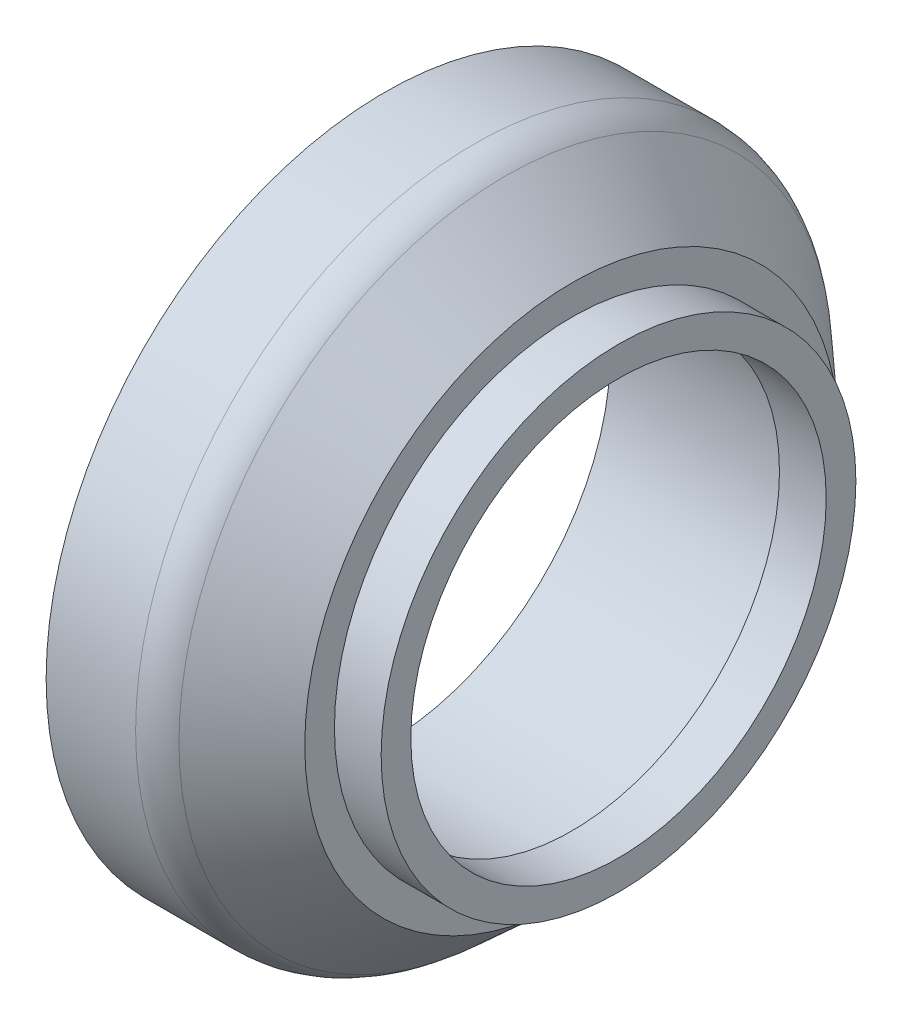
ISO-10303-21;
HEADER;
FILE_DESCRIPTION(('STEP AP214'),'2;1');
FILE_NAME('part.step','',(''),(''),'','','');
FILE_SCHEMA(('AUTOMOTIVE_DESIGN { 1 0 10303 214 1 1 1 1 }'));
ENDSEC;
DATA;
#1=APPLICATION_CONTEXT('core data for automotive mechanical design processes');
#2=APPLICATION_PROTOCOL_DEFINITION('international standard','automotive_design',2000,#1);
#3=PRODUCT_CONTEXT('',#1,'mechanical');
#4=PRODUCT('Part','Part','',(#3));
#5=PRODUCT_RELATED_PRODUCT_CATEGORY('part','',(#4));
#6=PRODUCT_DEFINITION_FORMATION('','',#4);
#7=PRODUCT_DEFINITION_CONTEXT('part definition',#1,'design');
#8=PRODUCT_DEFINITION('design','',#6,#7);
#9=PRODUCT_DEFINITION_SHAPE('','',#8);
#10=(LENGTH_UNIT() NAMED_UNIT(*) SI_UNIT(.MILLI.,.METRE.));
#11=(NAMED_UNIT(*) PLANE_ANGLE_UNIT() SI_UNIT($,.RADIAN.));
#12=(NAMED_UNIT(*) SI_UNIT($,.STERADIAN.) SOLID_ANGLE_UNIT());
#13=UNCERTAINTY_MEASURE_WITH_UNIT(LENGTH_MEASURE(1.E-05),#10,'distance_accuracy_value','');
#14=(GEOMETRIC_REPRESENTATION_CONTEXT(3) GLOBAL_UNCERTAINTY_ASSIGNED_CONTEXT((#13)) GLOBAL_UNIT_ASSIGNED_CONTEXT((#10,
#11,#12)) REPRESENTATION_CONTEXT('',''));
#15=CARTESIAN_POINT('',(0.,0.,0.));
#16=DIRECTION('',(0.,0.,1.));
#17=DIRECTION('',(1.,0.,0.));
#18=AXIS2_PLACEMENT_3D('',#15,#16,#17);
#19=CARTESIAN_POINT('',(40.,48.25,0.));
#20=DIRECTION('',(-1.,0.,0.));
#21=DIRECTION('',(0.,0.,1.));
#22=AXIS2_PLACEMENT_3D('',#19,#20,#21);
#23=PLANE('',#22);
#24=CARTESIAN_POINT('',(40.,0.,0.));
#25=DIRECTION('',(-1.,0.,0.));
#26=DIRECTION('',(0.,0.,1.));
#27=AXIS2_PLACEMENT_3D('',#24,#25,#26);
#28=CIRCLE('',#27,50.8);
#29=CARTESIAN_POINT('',(40.,0.,50.8));
#30=VERTEX_POINT('',#29);
#31=EDGE_CURVE('E152',#30,#30,#28,.F.);
#32=ORIENTED_EDGE('',*,*,#31,.F.);
#33=EDGE_LOOP('',(#32));
#34=FACE_BOUND('',#33,.T.);
#35=CARTESIAN_POINT('',(40.,0.,0.));
#36=DIRECTION('',(-1.,0.,0.));
#37=DIRECTION('',(0.,0.,1.));
#38=AXIS2_PLACEMENT_3D('',#35,#36,#37);
#39=CIRCLE('',#38,57.15);
#40=CARTESIAN_POINT('',(40.,0.,57.15));
#41=VERTEX_POINT('',#40);
#42=EDGE_CURVE('E164',#41,#41,#39,.T.);
#43=ORIENTED_EDGE('',*,*,#42,.F.);
#44=EDGE_LOOP('',(#43));
#45=FACE_BOUND('',#44,.T.);
#46=ADVANCED_FACE('F47',(#34,#45),#23,.F.);
#47=CARTESIAN_POINT('',(40.,0.,0.));
#48=DIRECTION('',(-1.,0.,0.));
#49=DIRECTION('',(0.,0.,1.));
#50=AXIS2_PLACEMENT_3D('',#47,#48,#49);
#51=CONICAL_SURFACE('',#50,57.15,0.73443768676526);
#52=CARTESIAN_POINT('',(25.8550285509689,0.,0.));
#53=DIRECTION('',(1.,0.,0.));
#54=DIRECTION('',(0.,0.,-1.));
#55=AXIS2_PLACEMENT_3D('',#52,#53,#54);
#56=CIRCLE('',#55,69.922077161331);
#57=CARTESIAN_POINT('',(25.8550285509689,0.,-69.922077161331));
#58=VERTEX_POINT('',#57);
#59=EDGE_CURVE('E156',#58,#58,#56,.T.);
#60=ORIENTED_EDGE('',*,*,#59,.T.);
#61=EDGE_LOOP('',(#60));
#62=FACE_BOUND('',#61,.T.);
#63=ORIENTED_EDGE('',*,*,#42,.T.);
#64=EDGE_LOOP('',(#63));
#65=FACE_BOUND('',#64,.T.);
#66=ADVANCED_FACE('F258',(#62,#65),#51,.T.);
#67=CARTESIAN_POINT('',(0.,0.,0.));
#68=DIRECTION('',(-1.,0.,0.));
#69=DIRECTION('',(0.,0.,1.));
#70=AXIS2_PLACEMENT_3D('',#67,#68,#69);
#71=CYLINDRICAL_SURFACE('',#70,72.5);
#72=CARTESIAN_POINT('',(19.1533294670613,0.,0.));
#73=DIRECTION('',(1.,0.,0.));
#74=DIRECTION('',(0.,0.,-1.));
#75=AXIS2_PLACEMENT_3D('',#72,#73,#74);
#76=CIRCLE('',#75,72.5);
#77=CARTESIAN_POINT('',(19.1533294670613,0.,-72.5));
#78=VERTEX_POINT('',#77);
#79=EDGE_CURVE('E160',#78,#78,#76,.F.);
#80=ORIENTED_EDGE('',*,*,#79,.T.);
#81=EDGE_LOOP('',(#80));
#82=FACE_BOUND('',#81,.T.);
#83=CARTESIAN_POINT('',(0.,0.,0.));
#84=DIRECTION('',(-1.,0.,0.));
#85=DIRECTION('',(0.,0.,1.));
#86=AXIS2_PLACEMENT_3D('',#83,#84,#85);
#87=CIRCLE('',#86,72.5);
#88=CARTESIAN_POINT('',(0.,0.,72.5));
#89=VERTEX_POINT('',#88);
#90=EDGE_CURVE('E168',#89,#89,#87,.T.);
#91=ORIENTED_EDGE('',*,*,#90,.F.);
#92=EDGE_LOOP('',(#91));
#93=FACE_BOUND('',#92,.T.);
#94=ADVANCED_FACE('F264',(#82,#93),#71,.T.);
#95=CARTESIAN_POINT('',(0.,72.5,0.));
#96=DIRECTION('',(1.,0.,0.));
#97=DIRECTION('',(0.,0.,-1.));
#98=AXIS2_PLACEMENT_3D('',#95,#96,#97);
#99=PLANE('',#98);
#100=CARTESIAN_POINT('',(0.,55.2672284458742,31.9085492205891));
#101=DIRECTION('',(1.,0.,0.));
#102=DIRECTION('',(0.,0.,-1.));
#103=AXIS2_PLACEMENT_3D('',#100,#101,#102);
#104=CIRCLE('',#103,6.35000000000001);
#105=CARTESIAN_POINT('',(0.,55.2672284458742,25.5585492205891));
#106=VERTEX_POINT('',#105);
#107=EDGE_CURVE('E10',#106,#106,#104,.T.);
#108=ORIENTED_EDGE('',*,*,#107,.T.);
#109=EDGE_LOOP('',(#108));
#110=FACE_BOUND('',#109,.T.);
#111=CARTESIAN_POINT('',(0.,31.9085492205904,55.2672284458734));
#112=DIRECTION('',(1.,0.,0.));
#113=DIRECTION('',(0.,0.,-1.));
#114=AXIS2_PLACEMENT_3D('',#111,#112,#113);
#115=CIRCLE('',#114,6.35);
#116=CARTESIAN_POINT('',(0.,31.9085492205904,48.9172284458734));
#117=VERTEX_POINT('',#116);
#118=EDGE_CURVE('E61',#117,#117,#115,.T.);
#119=ORIENTED_EDGE('',*,*,#118,.T.);
#120=EDGE_LOOP('',(#119));
#121=FACE_BOUND('',#120,.T.);
#122=CARTESIAN_POINT('',(0.,6.68448624919481E-13,63.8170984411796));
#123=DIRECTION('',(1.,0.,0.));
#124=DIRECTION('',(0.,0.,-1.));
#125=AXIS2_PLACEMENT_3D('',#122,#123,#124);
#126=CIRCLE('',#125,6.35000000000002);
#127=CARTESIAN_POINT('',(0.,6.68448624919481E-13,57.4670984411795));
#128=VERTEX_POINT('',#127);
#129=EDGE_CURVE('E72',#128,#128,#126,.T.);
#130=ORIENTED_EDGE('',*,*,#129,.T.);
#131=EDGE_LOOP('',(#130));
#132=FACE_BOUND('',#131,.T.);
#133=CARTESIAN_POINT('',(0.,-31.9085492205893,55.2672284458741));
#134=DIRECTION('',(1.,0.,0.));
#135=DIRECTION('',(0.,0.,-1.));
#136=AXIS2_PLACEMENT_3D('',#133,#134,#135);
#137=CIRCLE('',#136,6.35);
#138=CARTESIAN_POINT('',(0.,-31.9085492205893,48.9172284458741));
#139=VERTEX_POINT('',#138);
#140=EDGE_CURVE('E80',#139,#139,#137,.T.);
#141=ORIENTED_EDGE('',*,*,#140,.T.);
#142=EDGE_LOOP('',(#141));
#143=FACE_BOUND('',#142,.T.);
#144=CARTESIAN_POINT('',(0.,-55.2672284458735,31.9085492205902));
#145=DIRECTION('',(1.,0.,0.));
#146=DIRECTION('',(0.,0.,-1.));
#147=AXIS2_PLACEMENT_3D('',#144,#145,#146);
#148=CIRCLE('',#147,6.35000000000001);
#149=CARTESIAN_POINT('',(0.,-55.2672284458735,25.5585492205902));
#150=VERTEX_POINT('',#149);
#151=EDGE_CURVE('E88',#150,#150,#148,.T.);
#152=ORIENTED_EDGE('',*,*,#151,.T.);
#153=EDGE_LOOP('',(#152));
#154=FACE_BOUND('',#153,.T.);
#155=CARTESIAN_POINT('',(0.,-63.8170984411796,0.));
#156=DIRECTION('',(1.,0.,0.));
#157=DIRECTION('',(0.,0.,-1.));
#158=AXIS2_PLACEMENT_3D('',#155,#156,#157);
#159=CIRCLE('',#158,6.35000000000002);
#160=CARTESIAN_POINT('',(0.,-63.8170984411796,-6.35000000000002));
#161=VERTEX_POINT('',#160);
#162=EDGE_CURVE('E96',#161,#161,#159,.T.);
#163=ORIENTED_EDGE('',*,*,#162,.T.);
#164=EDGE_LOOP('',(#163));
#165=FACE_BOUND('',#164,.T.);
#166=CARTESIAN_POINT('',(0.,-55.267228445874,-31.9085492205895));
#167=DIRECTION('',(1.,0.,0.));
#168=DIRECTION('',(0.,0.,-1.));
#169=AXIS2_PLACEMENT_3D('',#166,#167,#168);
#170=CIRCLE('',#169,6.34999999999998);
#171=CARTESIAN_POINT('',(0.,-55.267228445874,-38.2585492205894));
#172=VERTEX_POINT('',#171);
#173=EDGE_CURVE('E104',#172,#172,#170,.T.);
#174=ORIENTED_EDGE('',*,*,#173,.T.);
#175=EDGE_LOOP('',(#174));
#176=FACE_BOUND('',#175,.T.);
#177=CARTESIAN_POINT('',(0.,-31.90854922059,-55.2672284458737));
#178=DIRECTION('',(1.,0.,0.));
#179=DIRECTION('',(0.,0.,-1.));
#180=AXIS2_PLACEMENT_3D('',#177,#178,#179);
#181=CIRCLE('',#180,6.35000000000001);
#182=CARTESIAN_POINT('',(0.,-31.90854922059,-61.6172284458737));
#183=VERTEX_POINT('',#182);
#184=EDGE_CURVE('E112',#183,#183,#181,.T.);
#185=ORIENTED_EDGE('',*,*,#184,.T.);
#186=EDGE_LOOP('',(#185));
#187=FACE_BOUND('',#186,.T.);
#188=CARTESIAN_POINT('',(0.,-2.22816208306494E-13,-63.8170984411796));
#189=DIRECTION('',(1.,0.,0.));
#190=DIRECTION('',(0.,0.,-1.));
#191=AXIS2_PLACEMENT_3D('',#188,#189,#190);
#192=CIRCLE('',#191,6.35000000000002);
#193=CARTESIAN_POINT('',(0.,-2.22816208306494E-13,-70.1670984411796));
#194=VERTEX_POINT('',#193);
#195=EDGE_CURVE('E120',#194,#194,#192,.T.);
#196=ORIENTED_EDGE('',*,*,#195,.T.);
#197=EDGE_LOOP('',(#196));
#198=FACE_BOUND('',#197,.T.);
#199=CARTESIAN_POINT('',(0.,31.9085492205897,-55.2672284458739));
#200=DIRECTION('',(1.,0.,0.));
#201=DIRECTION('',(0.,0.,-1.));
#202=AXIS2_PLACEMENT_3D('',#199,#200,#201);
#203=CIRCLE('',#202,6.35000000000004);
#204=CARTESIAN_POINT('',(0.,31.9085492205897,-48.9172284458738));
#205=VERTEX_POINT('',#204);
#206=EDGE_CURVE('E128',#205,#205,#203,.T.);
#207=ORIENTED_EDGE('',*,*,#206,.T.);
#208=EDGE_LOOP('',(#207));
#209=FACE_BOUND('',#208,.T.);
#210=CARTESIAN_POINT('',(0.,55.2672284458738,-31.9085492205898));
#211=DIRECTION('',(1.,0.,0.));
#212=DIRECTION('',(0.,0.,-1.));
#213=AXIS2_PLACEMENT_3D('',#210,#211,#212);
#214=CIRCLE('',#213,6.34999999999998);
#215=CARTESIAN_POINT('',(0.,55.2672284458738,-38.2585492205898));
#216=VERTEX_POINT('',#215);
#217=EDGE_CURVE('E136',#216,#216,#214,.T.);
#218=ORIENTED_EDGE('',*,*,#217,.T.);
#219=EDGE_LOOP('',(#218));
#220=FACE_BOUND('',#219,.T.);
#221=CARTESIAN_POINT('',(0.,63.8170984411796,0.));
#222=DIRECTION('',(1.,0.,0.));
#223=DIRECTION('',(0.,0.,-1.));
#224=AXIS2_PLACEMENT_3D('',#221,#222,#223);
#225=CIRCLE('',#224,6.35000000000002);
#226=CARTESIAN_POINT('',(0.,63.8170984411796,-6.35000000000002));
#227=VERTEX_POINT('',#226);
#228=EDGE_CURVE('E144',#227,#227,#225,.T.);
#229=ORIENTED_EDGE('',*,*,#228,.T.);
#230=EDGE_LOOP('',(#229));
#231=FACE_BOUND('',#230,.T.);
#232=CARTESIAN_POINT('',(0.,0.,0.));
#233=DIRECTION('',(-1.,0.,0.));
#234=DIRECTION('',(0.,0.,1.));
#235=AXIS2_PLACEMENT_3D('',#232,#233,#234);
#236=CIRCLE('',#235,48.25);
#237=CARTESIAN_POINT('',(0.,0.,48.25));
#238=VERTEX_POINT('',#237);
#239=EDGE_CURVE('E172',#238,#238,#236,.T.);
#240=ORIENTED_EDGE('',*,*,#239,.F.);
#241=EDGE_LOOP('',(#240));
#242=FACE_BOUND('',#241,.T.);
#243=ORIENTED_EDGE('',*,*,#90,.T.);
#244=EDGE_LOOP('',(#243));
#245=FACE_BOUND('',#244,.T.);
#246=ADVANCED_FACE('F363',(#110,#121,#132,#143,#154,#165,#176,#187,#198,#209,#220,#231,#242,
#245),#99,.F.);
#247=CARTESIAN_POINT('',(0.,0.,0.));
#248=DIRECTION('',(-1.,0.,0.));
#249=DIRECTION('',(0.,0.,1.));
#250=AXIS2_PLACEMENT_3D('',#247,#248,#249);
#251=CYLINDRICAL_SURFACE('',#250,48.25);
#252=CARTESIAN_POINT('',(40.,0.,0.));
#253=DIRECTION('',(-1.,0.,0.));
#254=DIRECTION('',(0.,0.,1.));
#255=AXIS2_PLACEMENT_3D('',#252,#253,#254);
#256=CIRCLE('',#255,48.25);
#257=CARTESIAN_POINT('',(40.,0.,48.25));
#258=VERTEX_POINT('',#257);
#259=EDGE_CURVE('E176',#258,#258,#256,.T.);
#260=ORIENTED_EDGE('',*,*,#259,.F.);
#261=EDGE_LOOP('',(#260));
#262=FACE_BOUND('',#261,.T.);
#263=ORIENTED_EDGE('',*,*,#239,.T.);
#264=EDGE_LOOP('',(#263));
#265=FACE_BOUND('',#264,.T.);
#266=ADVANCED_FACE('F275',(#262,#265),#251,.F.);
#267=CARTESIAN_POINT('',(19.1533294670613,0.,0.));
#268=DIRECTION('',(1.,0.,0.));
#269=DIRECTION('',(0.,0.,-1.));
#270=AXIS2_PLACEMENT_3D('',#267,#268,#269);
#271=TOROIDAL_SURFACE('',#270,62.5,10.);
#272=ORIENTED_EDGE('',*,*,#59,.F.);
#273=EDGE_LOOP('',(#272));
#274=FACE_BOUND('',#273,.T.);
#275=ORIENTED_EDGE('',*,*,#79,.F.);
#276=EDGE_LOOP('',(#275));
#277=FACE_BOUND('',#276,.T.);
#278=ADVANCED_FACE('F271',(#274,#277),#271,.T.);
#279=CARTESIAN_POINT('',(40.,0.,0.));
#280=DIRECTION('',(1.,0.,0.));
#281=DIRECTION('',(0.,0.,-1.));
#282=AXIS2_PLACEMENT_3D('',#279,#280,#281);
#283=PLANE('',#282);
#284=CARTESIAN_POINT('',(40.,0.,0.));
#285=DIRECTION('',(1.,0.,0.));
#286=DIRECTION('',(0.,0.,-1.));
#287=AXIS2_PLACEMENT_3D('',#284,#285,#286);
#288=CIRCLE('',#287,44.45);
#289=CARTESIAN_POINT('',(40.,0.,-44.45));
#290=VERTEX_POINT('',#289);
#291=EDGE_CURVE('E185',#290,#290,#288,.T.);
#292=ORIENTED_EDGE('',*,*,#291,.T.);
#293=EDGE_LOOP('',(#292));
#294=FACE_BOUND('',#293,.T.);
#295=ORIENTED_EDGE('',*,*,#259,.T.);
#296=EDGE_LOOP('',(#295));
#297=FACE_BOUND('',#296,.T.);
#298=ADVANCED_FACE('F274',(#294,#297),#283,.F.);
#299=CARTESIAN_POINT('',(50.,0.,0.));
#300=DIRECTION('',(1.,0.,0.));
#301=DIRECTION('',(0.,0.,-1.));
#302=AXIS2_PLACEMENT_3D('',#299,#300,#301);
#303=PLANE('',#302);
#304=CARTESIAN_POINT('',(50.,0.,0.));
#305=DIRECTION('',(1.,0.,0.));
#306=DIRECTION('',(0.,0.,-1.));
#307=AXIS2_PLACEMENT_3D('',#304,#305,#306);
#308=CIRCLE('',#307,50.8);
#309=CARTESIAN_POINT('',(50.,0.,-50.8));
#310=VERTEX_POINT('',#309);
#311=EDGE_CURVE('E180',#310,#310,#308,.T.);
#312=ORIENTED_EDGE('',*,*,#311,.T.);
#313=EDGE_LOOP('',(#312));
#314=FACE_BOUND('',#313,.T.);
#315=CARTESIAN_POINT('',(50.,0.,0.));
#316=DIRECTION('',(1.,0.,0.));
#317=DIRECTION('',(0.,0.,-1.));
#318=AXIS2_PLACEMENT_3D('',#315,#316,#317);
#319=CIRCLE('',#318,44.45);
#320=CARTESIAN_POINT('',(50.,0.,-44.45));
#321=VERTEX_POINT('',#320);
#322=EDGE_CURVE('E184',#321,#321,#319,.T.);
#323=ORIENTED_EDGE('',*,*,#322,.F.);
#324=EDGE_LOOP('',(#323));
#325=FACE_BOUND('',#324,.T.);
#326=ADVANCED_FACE('F403',(#314,#325),#303,.T.);
#327=CARTESIAN_POINT('',(50.,0.,0.));
#328=DIRECTION('',(-1.,0.,0.));
#329=DIRECTION('',(0.,0.,1.));
#330=AXIS2_PLACEMENT_3D('',#327,#328,#329);
#331=CYLINDRICAL_SURFACE('',#330,50.8);
#332=ORIENTED_EDGE('',*,*,#311,.F.);
#333=EDGE_LOOP('',(#332));
#334=FACE_BOUND('',#333,.T.);
#335=ORIENTED_EDGE('',*,*,#31,.T.);
#336=EDGE_LOOP('',(#335));
#337=FACE_BOUND('',#336,.T.);
#338=ADVANCED_FACE('F399',(#334,#337),#331,.T.);
#339=CARTESIAN_POINT('',(50.,0.,0.));
#340=DIRECTION('',(-1.,0.,0.));
#341=DIRECTION('',(0.,0.,1.));
#342=AXIS2_PLACEMENT_3D('',#339,#340,#341);
#343=CYLINDRICAL_SURFACE('',#342,44.45);
#344=ORIENTED_EDGE('',*,*,#322,.T.);
#345=EDGE_LOOP('',(#344));
#346=FACE_BOUND('',#345,.T.);
#347=ORIENTED_EDGE('',*,*,#291,.F.);
#348=EDGE_LOOP('',(#347));
#349=FACE_BOUND('',#348,.T.);
#350=ADVANCED_FACE('F402',(#346,#349),#343,.F.);
#351=CARTESIAN_POINT('',(19.4,63.8170984411796,0.));
#352=DIRECTION('',(-1.,0.,0.));
#353=DIRECTION('',(0.,0.,1.));
#354=AXIS2_PLACEMENT_3D('',#351,#352,#353);
#355=CYLINDRICAL_SURFACE('',#354,5.35);
#356=CARTESIAN_POINT('',(0.999999999999984,63.8170984411796,0.));
#357=DIRECTION('',(1.,0.,0.));
#358=DIRECTION('',(0.,0.,-1.));
#359=AXIS2_PLACEMENT_3D('',#356,#357,#358);
#360=CIRCLE('',#359,5.35);
#361=CARTESIAN_POINT('',(0.999999999999984,63.8170984411796,-5.35));
#362=VERTEX_POINT('',#361);
#363=EDGE_CURVE('E148',#362,#362,#360,.F.);
#364=ORIENTED_EDGE('',*,*,#363,.T.);
#365=EDGE_LOOP('',(#364));
#366=FACE_BOUND('',#365,.T.);
#367=CARTESIAN_POINT('',(19.4,63.8170984411796,0.));
#368=DIRECTION('',(-1.,0.,0.));
#369=DIRECTION('',(0.,0.,1.));
#370=AXIS2_PLACEMENT_3D('',#367,#368,#369);
#371=CIRCLE('',#370,5.35);
#372=CARTESIAN_POINT('',(19.4,63.8170984411796,5.35));
#373=VERTEX_POINT('',#372);
#374=EDGE_CURVE('E189',#373,#373,#371,.T.);
#375=ORIENTED_EDGE('',*,*,#374,.F.);
#376=EDGE_LOOP('',(#375));
#377=FACE_BOUND('',#376,.T.);
#378=ADVANCED_FACE('F413',(#366,#377),#355,.F.);
#379=CARTESIAN_POINT('',(19.4,63.8170984411796,0.));
#380=DIRECTION('',(-1.,0.,0.));
#381=DIRECTION('',(0.,0.,1.));
#382=AXIS2_PLACEMENT_3D('',#379,#380,#381);
#383=PLANE('',#382);
#384=ORIENTED_EDGE('',*,*,#374,.T.);
#385=EDGE_LOOP('',(#384));
#386=FACE_BOUND('',#385,.T.);
#387=ADVANCED_FACE('F285',(#386),#383,.T.);
#388=CARTESIAN_POINT('',(0.999999999999984,63.8170984411796,0.));
#389=DIRECTION('',(-1.,0.,0.));
#390=DIRECTION('',(0.,0.,1.));
#391=AXIS2_PLACEMENT_3D('',#388,#389,#390);
#392=CONICAL_SURFACE('',#391,5.35,0.785398163397467);
#393=ORIENTED_EDGE('',*,*,#228,.F.);
#394=EDGE_LOOP('',(#393));
#395=FACE_BOUND('',#394,.T.);
#396=ORIENTED_EDGE('',*,*,#363,.F.);
#397=EDGE_LOOP('',(#396));
#398=FACE_BOUND('',#397,.T.);
#399=ADVANCED_FACE('F278',(#395,#398),#392,.F.);
#400=CARTESIAN_POINT('',(19.4,55.2672284458738,-31.9085492205898));
#401=DIRECTION('',(-1.,0.,0.));
#402=DIRECTION('',(0.,0.,1.));
#403=AXIS2_PLACEMENT_3D('',#400,#401,#402);
#404=CYLINDRICAL_SURFACE('',#403,5.35);
#405=CARTESIAN_POINT('',(0.999999999999956,55.2672284458738,-31.9085492205898));
#406=DIRECTION('',(1.,0.,0.));
#407=DIRECTION('',(0.,0.,-1.));
#408=AXIS2_PLACEMENT_3D('',#405,#406,#407);
#409=CIRCLE('',#408,5.35);
#410=CARTESIAN_POINT('',(0.999999999999956,55.2672284458738,-37.2585492205898));
#411=VERTEX_POINT('',#410);
#412=EDGE_CURVE('E140',#411,#411,#409,.F.);
#413=ORIENTED_EDGE('',*,*,#412,.T.);
#414=EDGE_LOOP('',(#413));
#415=FACE_BOUND('',#414,.T.);
#416=CARTESIAN_POINT('',(19.4,55.2672284458738,-31.9085492205898));
#417=DIRECTION('',(-1.,0.,0.));
#418=DIRECTION('',(0.,0.500000000000001,0.866025403784438));
#419=AXIS2_PLACEMENT_3D('',#416,#417,#418);
#420=CIRCLE('',#419,5.35);
#421=CARTESIAN_POINT('',(19.4,57.9422284458738,-27.2753133103431));
#422=VERTEX_POINT('',#421);
#423=EDGE_CURVE('E196',#422,#422,#420,.T.);
#424=ORIENTED_EDGE('',*,*,#423,.F.);
#425=EDGE_LOOP('',(#424));
#426=FACE_BOUND('',#425,.T.);
#427=ADVANCED_FACE('F284',(#415,#426),#404,.F.);
#428=CARTESIAN_POINT('',(19.4,55.2672284458738,-31.9085492205898));
#429=DIRECTION('',(-1.,0.,0.));
#430=DIRECTION('',(0.,0.500000000000001,0.866025403784438));
#431=AXIS2_PLACEMENT_3D('',#428,#429,#430);
#432=PLANE('',#431);
#433=ORIENTED_EDGE('',*,*,#423,.T.);
#434=EDGE_LOOP('',(#433));
#435=FACE_BOUND('',#434,.T.);
#436=ADVANCED_FACE('F423',(#435),#432,.T.);
#437=CARTESIAN_POINT('',(19.4,55.2672284458742,31.9085492205891));
#438=DIRECTION('',(-1.,0.,0.));
#439=DIRECTION('',(0.,0.,1.));
#440=AXIS2_PLACEMENT_3D('',#437,#438,#439);
#441=CYLINDRICAL_SURFACE('',#440,5.35);
#442=CARTESIAN_POINT('',(0.999999999999984,55.2672284458742,31.9085492205891));
#443=DIRECTION('',(1.,0.,0.));
#444=DIRECTION('',(0.,0.,-1.));
#445=AXIS2_PLACEMENT_3D('',#442,#443,#444);
#446=CIRCLE('',#445,5.35);
#447=CARTESIAN_POINT('',(0.999999999999984,55.2672284458742,26.5585492205891));
#448=VERTEX_POINT('',#447);
#449=EDGE_CURVE('E56',#448,#448,#446,.F.);
#450=ORIENTED_EDGE('',*,*,#449,.T.);
#451=EDGE_LOOP('',(#450));
#452=FACE_BOUND('',#451,.T.);
#453=CARTESIAN_POINT('',(19.4,55.2672284458742,31.9085492205891));
#454=DIRECTION('',(-1.,0.,0.));
#455=DIRECTION('',(0.,-0.499999999999989,0.866025403784445));
#456=AXIS2_PLACEMENT_3D('',#453,#454,#455);
#457=CIRCLE('',#456,5.35);
#458=CARTESIAN_POINT('',(19.4,52.5922284458743,36.5417851308359));
#459=VERTEX_POINT('',#458);
#460=EDGE_CURVE('E233',#459,#459,#457,.T.);
#461=ORIENTED_EDGE('',*,*,#460,.F.);
#462=EDGE_LOOP('',(#461));
#463=FACE_BOUND('',#462,.T.);
#464=ADVANCED_FACE('F254',(#452,#463),#441,.F.);
#465=CARTESIAN_POINT('',(19.4,55.2672284458742,31.9085492205891));
#466=DIRECTION('',(-1.,0.,0.));
#467=DIRECTION('',(0.,-0.499999999999989,0.866025403784445));
#468=AXIS2_PLACEMENT_3D('',#465,#466,#467);
#469=PLANE('',#468);
#470=ORIENTED_EDGE('',*,*,#460,.T.);
#471=EDGE_LOOP('',(#470));
#472=FACE_BOUND('',#471,.T.);
#473=ADVANCED_FACE('F245',(#472),#469,.T.);
#474=CARTESIAN_POINT('',(19.4,31.9085492205904,55.2672284458734));
#475=DIRECTION('',(-1.,0.,0.));
#476=DIRECTION('',(0.,0.,1.));
#477=AXIS2_PLACEMENT_3D('',#474,#475,#476);
#478=CYLINDRICAL_SURFACE('',#477,5.35);
#479=CARTESIAN_POINT('',(0.999999999999984,31.9085492205904,55.2672284458734));
#480=DIRECTION('',(1.,0.,0.));
#481=DIRECTION('',(0.,0.,-1.));
#482=AXIS2_PLACEMENT_3D('',#479,#480,#481);
#483=CIRCLE('',#482,5.35);
#484=CARTESIAN_POINT('',(0.999999999999984,31.9085492205904,49.9172284458734));
#485=VERTEX_POINT('',#484);
#486=EDGE_CURVE('E66',#485,#485,#483,.F.);
#487=ORIENTED_EDGE('',*,*,#486,.T.);
#488=EDGE_LOOP('',(#487));
#489=FACE_BOUND('',#488,.T.);
#490=CARTESIAN_POINT('',(19.4,31.9085492205904,55.2672284458734));
#491=DIRECTION('',(-1.,0.,0.));
#492=DIRECTION('',(0.,-0.866025403784433,0.50000000000001));
#493=AXIS2_PLACEMENT_3D('',#490,#491,#492);
#494=CIRCLE('',#493,5.35);
#495=CARTESIAN_POINT('',(19.4,27.2753133103437,57.9422284458735));
#496=VERTEX_POINT('',#495);
#497=EDGE_CURVE('E206',#496,#496,#494,.T.);
#498=ORIENTED_EDGE('',*,*,#497,.F.);
#499=EDGE_LOOP('',(#498));
#500=FACE_BOUND('',#499,.T.);
#501=ADVANCED_FACE('F243',(#489,#500),#478,.F.);
#502=CARTESIAN_POINT('',(19.4,31.9085492205904,55.2672284458734));
#503=DIRECTION('',(-1.,0.,0.));
#504=DIRECTION('',(0.,-0.866025403784433,0.50000000000001));
#505=AXIS2_PLACEMENT_3D('',#502,#503,#504);
#506=PLANE('',#505);
#507=ORIENTED_EDGE('',*,*,#497,.T.);
#508=EDGE_LOOP('',(#507));
#509=FACE_BOUND('',#508,.T.);
#510=ADVANCED_FACE('F241',(#509),#506,.T.);
#511=CARTESIAN_POINT('',(19.4,6.68448624919481E-13,63.8170984411796));
#512=DIRECTION('',(-1.,0.,0.));
#513=DIRECTION('',(0.,0.,1.));
#514=AXIS2_PLACEMENT_3D('',#511,#512,#513);
#515=CYLINDRICAL_SURFACE('',#514,5.35);
#516=CARTESIAN_POINT('',(0.999999999999984,6.68448624919481E-13,63.8170984411796));
#517=DIRECTION('',(1.,0.,0.));
#518=DIRECTION('',(0.,0.,-1.));
#519=AXIS2_PLACEMENT_3D('',#516,#517,#518);
#520=CIRCLE('',#519,5.35);
#521=CARTESIAN_POINT('',(0.999999999999984,6.68448624919481E-13,58.4670984411796));
#522=VERTEX_POINT('',#521);
#523=EDGE_CURVE('E76',#522,#522,#520,.F.);
#524=ORIENTED_EDGE('',*,*,#523,.T.);
#525=EDGE_LOOP('',(#524));
#526=FACE_BOUND('',#525,.T.);
#527=CARTESIAN_POINT('',(19.4,6.68448624919481E-13,63.8170984411796));
#528=DIRECTION('',(-1.,0.,0.));
#529=DIRECTION('',(0.,-1.,0.));
#530=AXIS2_PLACEMENT_3D('',#527,#528,#529);
#531=CIRCLE('',#530,5.35);
#532=CARTESIAN_POINT('',(19.4,-5.34999999999933,63.8170984411796));
#533=VERTEX_POINT('',#532);
#534=EDGE_CURVE('E201',#533,#533,#531,.T.);
#535=ORIENTED_EDGE('',*,*,#534,.F.);
#536=EDGE_LOOP('',(#535));
#537=FACE_BOUND('',#536,.T.);
#538=ADVANCED_FACE('F252',(#526,#537),#515,.F.);
#539=CARTESIAN_POINT('',(19.4,6.68448624919481E-13,63.8170984411796));
#540=DIRECTION('',(-1.,0.,0.));
#541=DIRECTION('',(0.,-1.,0.));
#542=AXIS2_PLACEMENT_3D('',#539,#540,#541);
#543=PLANE('',#542);
#544=ORIENTED_EDGE('',*,*,#534,.T.);
#545=EDGE_LOOP('',(#544));
#546=FACE_BOUND('',#545,.T.);
#547=ADVANCED_FACE('F430',(#546),#543,.T.);
#548=CARTESIAN_POINT('',(19.4,-31.9085492205893,55.2672284458741));
#549=DIRECTION('',(-1.,0.,0.));
#550=DIRECTION('',(0.,0.,1.));
#551=AXIS2_PLACEMENT_3D('',#548,#549,#550);
#552=CYLINDRICAL_SURFACE('',#551,5.35);
#553=CARTESIAN_POINT('',(0.999999999999984,-31.9085492205893,55.2672284458741));
#554=DIRECTION('',(1.,0.,0.));
#555=DIRECTION('',(0.,0.,-1.));
#556=AXIS2_PLACEMENT_3D('',#553,#554,#555);
#557=CIRCLE('',#556,5.35);
#558=CARTESIAN_POINT('',(0.999999999999984,-31.9085492205893,49.9172284458741));
#559=VERTEX_POINT('',#558);
#560=EDGE_CURVE('E84',#559,#559,#557,.F.);
#561=ORIENTED_EDGE('',*,*,#560,.T.);
#562=EDGE_LOOP('',(#561));
#563=FACE_BOUND('',#562,.T.);
#564=CARTESIAN_POINT('',(19.4,-31.9085492205893,55.2672284458741));
#565=DIRECTION('',(-1.,0.,0.));
#566=DIRECTION('',(0.,-0.866025403784443,-0.499999999999992));
#567=AXIS2_PLACEMENT_3D('',#564,#565,#566);
#568=CIRCLE('',#567,5.35);
#569=CARTESIAN_POINT('',(19.4,-36.541785130836,52.5922284458741));
#570=VERTEX_POINT('',#569);
#571=EDGE_CURVE('E205',#570,#570,#568,.T.);
#572=ORIENTED_EDGE('',*,*,#571,.F.);
#573=EDGE_LOOP('',(#572));
#574=FACE_BOUND('',#573,.T.);
#575=ADVANCED_FACE('F434',(#563,#574),#552,.F.);
#576=CARTESIAN_POINT('',(19.4,-31.9085492205893,55.2672284458741));
#577=DIRECTION('',(-1.,0.,0.));
#578=DIRECTION('',(0.,-0.866025403784443,-0.499999999999992));
#579=AXIS2_PLACEMENT_3D('',#576,#577,#578);
#580=PLANE('',#579);
#581=ORIENTED_EDGE('',*,*,#571,.T.);
#582=EDGE_LOOP('',(#581));
#583=FACE_BOUND('',#582,.T.);
#584=ADVANCED_FACE('F438',(#583),#580,.T.);
#585=CARTESIAN_POINT('',(19.4,-55.2672284458735,31.9085492205902));
#586=DIRECTION('',(-1.,0.,0.));
#587=DIRECTION('',(0.,0.,1.));
#588=AXIS2_PLACEMENT_3D('',#585,#586,#587);
#589=CYLINDRICAL_SURFACE('',#588,5.35);
#590=CARTESIAN_POINT('',(0.999999999999984,-55.2672284458735,31.9085492205902));
#591=DIRECTION('',(1.,0.,0.));
#592=DIRECTION('',(0.,0.,-1.));
#593=AXIS2_PLACEMENT_3D('',#590,#591,#592);
#594=CIRCLE('',#593,5.35);
#595=CARTESIAN_POINT('',(0.999999999999984,-55.2672284458735,26.5585492205902));
#596=VERTEX_POINT('',#595);
#597=EDGE_CURVE('E92',#596,#596,#594,.F.);
#598=ORIENTED_EDGE('',*,*,#597,.T.);
#599=EDGE_LOOP('',(#598));
#600=FACE_BOUND('',#599,.T.);
#601=CARTESIAN_POINT('',(19.4,-55.2672284458735,31.9085492205902));
#602=DIRECTION('',(-1.,0.,0.));
#603=DIRECTION('',(0.,-0.500000000000007,-0.866025403784435));
#604=AXIS2_PLACEMENT_3D('',#601,#602,#603);
#605=CIRCLE('',#604,5.35);
#606=CARTESIAN_POINT('',(19.4,-57.9422284458736,27.2753133103435));
#607=VERTEX_POINT('',#606);
#608=EDGE_CURVE('E210',#607,#607,#605,.T.);
#609=ORIENTED_EDGE('',*,*,#608,.F.);
#610=EDGE_LOOP('',(#609));
#611=FACE_BOUND('',#610,.T.);
#612=ADVANCED_FACE('F442',(#600,#611),#589,.F.);
#613=CARTESIAN_POINT('',(19.4,-55.2672284458735,31.9085492205902));
#614=DIRECTION('',(-1.,0.,0.));
#615=DIRECTION('',(0.,-0.500000000000007,-0.866025403784435));
#616=AXIS2_PLACEMENT_3D('',#613,#614,#615);
#617=PLANE('',#616);
#618=ORIENTED_EDGE('',*,*,#608,.T.);
#619=EDGE_LOOP('',(#618));
#620=FACE_BOUND('',#619,.T.);
#621=ADVANCED_FACE('F446',(#620),#617,.T.);
#622=CARTESIAN_POINT('',(19.4,-63.8170984411796,0.));
#623=DIRECTION('',(-1.,0.,0.));
#624=DIRECTION('',(0.,0.,1.));
#625=AXIS2_PLACEMENT_3D('',#622,#623,#624);
#626=CYLINDRICAL_SURFACE('',#625,5.35);
#627=CARTESIAN_POINT('',(0.999999999999984,-63.8170984411796,0.));
#628=DIRECTION('',(1.,0.,0.));
#629=DIRECTION('',(0.,0.,-1.));
#630=AXIS2_PLACEMENT_3D('',#627,#628,#629);
#631=CIRCLE('',#630,5.35);
#632=CARTESIAN_POINT('',(0.999999999999984,-63.8170984411796,-5.35));
#633=VERTEX_POINT('',#632);
#634=EDGE_CURVE('E100',#633,#633,#631,.F.);
#635=ORIENTED_EDGE('',*,*,#634,.T.);
#636=EDGE_LOOP('',(#635));
#637=FACE_BOUND('',#636,.T.);
#638=CARTESIAN_POINT('',(19.4,-63.8170984411796,0.));
#639=DIRECTION('',(-1.,0.,0.));
#640=DIRECTION('',(0.,0.,-1.));
#641=AXIS2_PLACEMENT_3D('',#638,#639,#640);
#642=CIRCLE('',#641,5.35);
#643=CARTESIAN_POINT('',(19.4,-63.8170984411796,-5.35));
#644=VERTEX_POINT('',#643);
#645=EDGE_CURVE('E214',#644,#644,#642,.T.);
#646=ORIENTED_EDGE('',*,*,#645,.F.);
#647=EDGE_LOOP('',(#646));
#648=FACE_BOUND('',#647,.T.);
#649=ADVANCED_FACE('F450',(#637,#648),#626,.F.);
#650=CARTESIAN_POINT('',(19.4,-63.8170984411796,0.));
#651=DIRECTION('',(-1.,0.,0.));
#652=DIRECTION('',(0.,0.,-1.));
#653=AXIS2_PLACEMENT_3D('',#650,#651,#652);
#654=PLANE('',#653);
#655=ORIENTED_EDGE('',*,*,#645,.T.);
#656=EDGE_LOOP('',(#655));
#657=FACE_BOUND('',#656,.T.);
#658=ADVANCED_FACE('F454',(#657),#654,.T.);
#659=CARTESIAN_POINT('',(19.4,-55.267228445874,-31.9085492205895));
#660=DIRECTION('',(-1.,0.,0.));
#661=DIRECTION('',(0.,0.,1.));
#662=AXIS2_PLACEMENT_3D('',#659,#660,#661);
#663=CYLINDRICAL_SURFACE('',#662,5.35);
#664=CARTESIAN_POINT('',(0.99999999999998,-55.267228445874,-31.9085492205895));
#665=DIRECTION('',(1.,0.,0.));
#666=DIRECTION('',(0.,0.,-1.));
#667=AXIS2_PLACEMENT_3D('',#664,#665,#666);
#668=CIRCLE('',#667,5.35);
#669=CARTESIAN_POINT('',(0.99999999999998,-55.267228445874,-37.2585492205895));
#670=VERTEX_POINT('',#669);
#671=EDGE_CURVE('E108',#670,#670,#668,.F.);
#672=ORIENTED_EDGE('',*,*,#671,.T.);
#673=EDGE_LOOP('',(#672));
#674=FACE_BOUND('',#673,.T.);
#675=CARTESIAN_POINT('',(19.4,-55.267228445874,-31.9085492205895));
#676=DIRECTION('',(-1.,0.,0.));
#677=DIRECTION('',(0.,0.499999999999995,-0.866025403784442));
#678=AXIS2_PLACEMENT_3D('',#675,#676,#677);
#679=CIRCLE('',#678,5.35);
#680=CARTESIAN_POINT('',(19.4,-52.592228445874,-36.5417851308362));
#681=VERTEX_POINT('',#680);
#682=EDGE_CURVE('E218',#681,#681,#679,.T.);
#683=ORIENTED_EDGE('',*,*,#682,.F.);
#684=EDGE_LOOP('',(#683));
#685=FACE_BOUND('',#684,.T.);
#686=ADVANCED_FACE('F458',(#674,#685),#663,.F.);
#687=CARTESIAN_POINT('',(19.4,-55.267228445874,-31.9085492205895));
#688=DIRECTION('',(-1.,0.,0.));
#689=DIRECTION('',(0.,0.499999999999995,-0.866025403784442));
#690=AXIS2_PLACEMENT_3D('',#687,#688,#689);
#691=PLANE('',#690);
#692=ORIENTED_EDGE('',*,*,#682,.T.);
#693=EDGE_LOOP('',(#692));
#694=FACE_BOUND('',#693,.T.);
#695=ADVANCED_FACE('F462',(#694),#691,.T.);
#696=CARTESIAN_POINT('',(19.4,-31.90854922059,-55.2672284458737));
#697=DIRECTION('',(-1.,0.,0.));
#698=DIRECTION('',(0.,0.,1.));
#699=AXIS2_PLACEMENT_3D('',#696,#697,#698);
#700=CYLINDRICAL_SURFACE('',#699,5.35);
#701=CARTESIAN_POINT('',(1.00000000000001,-31.90854922059,-55.2672284458737));
#702=DIRECTION('',(1.,0.,0.));
#703=DIRECTION('',(0.,0.,-1.));
#704=AXIS2_PLACEMENT_3D('',#701,#702,#703);
#705=CIRCLE('',#704,5.35);
#706=CARTESIAN_POINT('',(1.00000000000001,-31.90854922059,-60.6172284458737));
#707=VERTEX_POINT('',#706);
#708=EDGE_CURVE('E116',#707,#707,#705,.F.);
#709=ORIENTED_EDGE('',*,*,#708,.T.);
#710=EDGE_LOOP('',(#709));
#711=FACE_BOUND('',#710,.T.);
#712=CARTESIAN_POINT('',(19.4,-31.90854922059,-55.2672284458737));
#713=DIRECTION('',(-1.,0.,0.));
#714=DIRECTION('',(0.,0.866025403784436,-0.500000000000004));
#715=AXIS2_PLACEMENT_3D('',#712,#713,#714);
#716=CIRCLE('',#715,5.35);
#717=CARTESIAN_POINT('',(19.4,-27.2753133103433,-57.9422284458737));
#718=VERTEX_POINT('',#717);
#719=EDGE_CURVE('E222',#718,#718,#716,.T.);
#720=ORIENTED_EDGE('',*,*,#719,.F.);
#721=EDGE_LOOP('',(#720));
#722=FACE_BOUND('',#721,.T.);
#723=ADVANCED_FACE('F466',(#711,#722),#700,.F.);
#724=CARTESIAN_POINT('',(19.4,-31.90854922059,-55.2672284458737));
#725=DIRECTION('',(-1.,0.,0.));
#726=DIRECTION('',(0.,0.866025403784436,-0.500000000000004));
#727=AXIS2_PLACEMENT_3D('',#724,#725,#726);
#728=PLANE('',#727);
#729=ORIENTED_EDGE('',*,*,#719,.T.);
#730=EDGE_LOOP('',(#729));
#731=FACE_BOUND('',#730,.T.);
#732=ADVANCED_FACE('F470',(#731),#728,.T.);
#733=CARTESIAN_POINT('',(19.4,-2.22816208306494E-13,-63.8170984411796));
#734=DIRECTION('',(-1.,0.,0.));
#735=DIRECTION('',(0.,0.,1.));
#736=AXIS2_PLACEMENT_3D('',#733,#734,#735);
#737=CYLINDRICAL_SURFACE('',#736,5.35);
#738=CARTESIAN_POINT('',(0.999999999999984,-2.22816208306494E-13,-63.8170984411796));
#739=DIRECTION('',(1.,0.,0.));
#740=DIRECTION('',(0.,0.,-1.));
#741=AXIS2_PLACEMENT_3D('',#738,#739,#740);
#742=CIRCLE('',#741,5.35);
#743=CARTESIAN_POINT('',(0.999999999999984,-2.22816208306494E-13,-69.1670984411796));
#744=VERTEX_POINT('',#743);
#745=EDGE_CURVE('E124',#744,#744,#742,.F.);
#746=ORIENTED_EDGE('',*,*,#745,.T.);
#747=EDGE_LOOP('',(#746));
#748=FACE_BOUND('',#747,.T.);
#749=CARTESIAN_POINT('',(19.4,-2.22816208306494E-13,-63.8170984411796));
#750=DIRECTION('',(-1.,0.,0.));
#751=DIRECTION('',(0.,1.,0.));
#752=AXIS2_PLACEMENT_3D('',#749,#750,#751);
#753=CIRCLE('',#752,5.35);
#754=CARTESIAN_POINT('',(19.4,5.34999999999978,-63.8170984411796));
#755=VERTEX_POINT('',#754);
#756=EDGE_CURVE('E226',#755,#755,#753,.T.);
#757=ORIENTED_EDGE('',*,*,#756,.F.);
#758=EDGE_LOOP('',(#757));
#759=FACE_BOUND('',#758,.T.);
#760=ADVANCED_FACE('F474',(#748,#759),#737,.F.);
#761=CARTESIAN_POINT('',(19.4,-2.22816208306494E-13,-63.8170984411796));
#762=DIRECTION('',(-1.,0.,0.));
#763=DIRECTION('',(0.,1.,0.));
#764=AXIS2_PLACEMENT_3D('',#761,#762,#763);
#765=PLANE('',#764);
#766=ORIENTED_EDGE('',*,*,#756,.T.);
#767=EDGE_LOOP('',(#766));
#768=FACE_BOUND('',#767,.T.);
#769=ADVANCED_FACE('F478',(#768),#765,.T.);
#770=CARTESIAN_POINT('',(19.4,31.9085492205897,-55.2672284458739));
#771=DIRECTION('',(-1.,0.,0.));
#772=DIRECTION('',(0.,0.,1.));
#773=AXIS2_PLACEMENT_3D('',#770,#771,#772);
#774=CYLINDRICAL_SURFACE('',#773,5.35);
#775=CARTESIAN_POINT('',(1.00000000000004,31.9085492205897,-55.2672284458739));
#776=DIRECTION('',(1.,0.,0.));
#777=DIRECTION('',(0.,0.,-1.));
#778=AXIS2_PLACEMENT_3D('',#775,#776,#777);
#779=CIRCLE('',#778,5.35);
#780=CARTESIAN_POINT('',(1.00000000000004,31.9085492205897,-49.9172284458739));
#781=VERTEX_POINT('',#780);
#782=EDGE_CURVE('E132',#781,#781,#779,.F.);
#783=ORIENTED_EDGE('',*,*,#782,.T.);
#784=EDGE_LOOP('',(#783));
#785=FACE_BOUND('',#784,.T.);
#786=CARTESIAN_POINT('',(19.4,31.9085492205897,-55.2672284458739));
#787=DIRECTION('',(-1.,0.,0.));
#788=DIRECTION('',(0.,0.86602540378444,0.499999999999998));
#789=AXIS2_PLACEMENT_3D('',#786,#787,#788);
#790=CIRCLE('',#789,5.35);
#791=CARTESIAN_POINT('',(19.4,36.5417851308364,-52.5922284458739));
#792=VERTEX_POINT('',#791);
#793=EDGE_CURVE('E200',#792,#792,#790,.T.);
#794=ORIENTED_EDGE('',*,*,#793,.F.);
#795=EDGE_LOOP('',(#794));
#796=FACE_BOUND('',#795,.T.);
#797=ADVANCED_FACE('F482',(#785,#796),#774,.F.);
#798=CARTESIAN_POINT('',(19.4,31.9085492205897,-55.2672284458739));
#799=DIRECTION('',(-1.,0.,0.));
#800=DIRECTION('',(0.,0.86602540378444,0.499999999999998));
#801=AXIS2_PLACEMENT_3D('',#798,#799,#800);
#802=PLANE('',#801);
#803=ORIENTED_EDGE('',*,*,#793,.T.);
#804=EDGE_LOOP('',(#803));
#805=FACE_BOUND('',#804,.T.);
#806=ADVANCED_FACE('F294',(#805),#802,.T.);
#807=CARTESIAN_POINT('',(0.999999999999956,55.2672284458738,-31.9085492205898));
#808=DIRECTION('',(-1.,0.,0.));
#809=DIRECTION('',(0.,0.,1.));
#810=AXIS2_PLACEMENT_3D('',#807,#808,#809);
#811=CONICAL_SURFACE('',#810,5.35,0.785398163397461);
#812=ORIENTED_EDGE('',*,*,#217,.F.);
#813=EDGE_LOOP('',(#812));
#814=FACE_BOUND('',#813,.T.);
#815=ORIENTED_EDGE('',*,*,#412,.F.);
#816=EDGE_LOOP('',(#815));
#817=FACE_BOUND('',#816,.T.);
#818=ADVANCED_FACE('F287',(#814,#817),#811,.F.);
#819=CARTESIAN_POINT('',(1.00000000000004,31.9085492205897,-55.2672284458739));
#820=DIRECTION('',(-1.,0.,0.));
#821=DIRECTION('',(0.,0.,1.));
#822=AXIS2_PLACEMENT_3D('',#819,#820,#821);
#823=CONICAL_SURFACE('',#822,5.35,0.78539816339745);
#824=CARTESIAN_POINT('',(0.,31.9085492205897,-48.9172284458738));
#825=CARTESIAN_POINT('',(0.0104166666666652,31.9085492205897,-48.9276451125405));
#826=CARTESIAN_POINT('',(0.0208333333333327,31.9085492205897,-48.9380617792072));
#827=CARTESIAN_POINT('',(0.0416666666666679,31.9085492205897,-48.9588951125405));
#828=CARTESIAN_POINT('',(0.0520833333333355,31.9085492205897,-48.9693117792072));
#829=CARTESIAN_POINT('',(0.0729166666666699,31.9085492205897,-48.9901451125405));
#830=CARTESIAN_POINT('',(0.0833333333333366,31.9085492205897,-49.0005617792072));
#831=CARTESIAN_POINT('',(0.10416666666667,31.9085492205897,-49.0213951125405));
#832=CARTESIAN_POINT('',(0.114583333333337,31.9085492205897,-49.0318117792072));
#833=CARTESIAN_POINT('',(0.135416666666671,31.9085492205897,-49.0526451125405));
#834=CARTESIAN_POINT('',(0.145833333333339,31.9085492205897,-49.0630617792072));
#835=CARTESIAN_POINT('',(0.166666666666674,31.9085492205897,-49.0838951125405));
#836=CARTESIAN_POINT('',(0.17708333333334,31.9085492205897,-49.0943117792072));
#837=CARTESIAN_POINT('',(0.197916666666674,31.9085492205897,-49.1151451125405));
#838=CARTESIAN_POINT('',(0.20833333333334,31.9085492205897,-49.1255617792072));
#839=CARTESIAN_POINT('',(0.229166666666675,31.9085492205897,-49.1463951125405));
#840=CARTESIAN_POINT('',(0.239583333333343,31.9085492205897,-49.1568117792072));
#841=CARTESIAN_POINT('',(0.260416666666677,31.9085492205897,-49.1776451125405));
#842=CARTESIAN_POINT('',(0.270833333333344,31.9085492205897,-49.1880617792072));
#843=CARTESIAN_POINT('',(0.291666666666677,31.9085492205897,-49.2088951125405));
#844=CARTESIAN_POINT('',(0.302083333333344,31.9085492205897,-49.2193117792072));
#845=CARTESIAN_POINT('',(0.322916666666679,31.9085492205897,-49.2401451125405));
#846=CARTESIAN_POINT('',(0.333333333333346,31.9085492205897,-49.2505617792072));
#847=CARTESIAN_POINT('',(0.354166666666681,31.9085492205897,-49.2713951125405));
#848=CARTESIAN_POINT('',(0.364583333333348,31.9085492205897,-49.2818117792072));
#849=CARTESIAN_POINT('',(0.385416666666681,31.9085492205897,-49.3026451125405));
#850=CARTESIAN_POINT('',(0.395833333333348,31.9085492205897,-49.3130617792072));
#851=CARTESIAN_POINT('',(0.416666666666682,31.9085492205897,-49.3338951125405));
#852=CARTESIAN_POINT('',(0.42708333333335,31.9085492205897,-49.3443117792072));
#853=CARTESIAN_POINT('',(0.447916666666685,31.9085492205897,-49.3651451125405));
#854=CARTESIAN_POINT('',(0.458333333333352,31.9085492205897,-49.3755617792072));
#855=CARTESIAN_POINT('',(0.479166666666685,31.9085492205897,-49.3963951125405));
#856=CARTESIAN_POINT('',(0.489583333333352,31.9085492205897,-49.4068117792072));
#857=CARTESIAN_POINT('',(0.510416666666686,31.9085492205897,-49.4276451125405));
#858=CARTESIAN_POINT('',(0.520833333333354,31.9085492205897,-49.4380617792072));
#859=CARTESIAN_POINT('',(0.541666666666688,31.9085492205897,-49.4588951125405));
#860=CARTESIAN_POINT('',(0.552083333333355,31.9085492205897,-49.4693117792072));
#861=CARTESIAN_POINT('',(0.572916666666689,31.9085492205897,-49.4901451125405));
#862=CARTESIAN_POINT('',(0.583333333333356,31.9085492205897,-49.5005617792072));
#863=CARTESIAN_POINT('',(0.60416666666669,31.9085492205897,-49.5213951125405));
#864=CARTESIAN_POINT('',(0.614583333333356,31.9085492205897,-49.5318117792072));
#865=CARTESIAN_POINT('',(0.635416666666691,31.9085492205897,-49.5526451125405));
#866=CARTESIAN_POINT('',(0.645833333333359,31.9085492205897,-49.5630617792072));
#867=CARTESIAN_POINT('',(0.666666666666693,31.9085492205897,-49.5838951125405));
#868=CARTESIAN_POINT('',(0.67708333333336,31.9085492205897,-49.5943117792072));
#869=CARTESIAN_POINT('',(0.697916666666693,31.9085492205897,-49.6151451125405));
#870=CARTESIAN_POINT('',(0.70833333333336,31.9085492205897,-49.6255617792072));
#871=CARTESIAN_POINT('',(0.729166666666695,31.9085492205897,-49.6463951125405));
#872=CARTESIAN_POINT('',(0.739583333333363,31.9085492205897,-49.6568117792072));
#873=CARTESIAN_POINT('',(0.760416666666697,31.9085492205897,-49.6776451125405));
#874=CARTESIAN_POINT('',(0.770833333333364,31.9085492205897,-49.6880617792072));
#875=CARTESIAN_POINT('',(0.791666666666697,31.9085492205897,-49.7088951125405));
#876=CARTESIAN_POINT('',(0.802083333333364,31.9085492205897,-49.7193117792072));
#877=CARTESIAN_POINT('',(0.822916666666698,31.9085492205897,-49.7401451125405));
#878=CARTESIAN_POINT('',(0.833333333333366,31.9085492205897,-49.7505617792072));
#879=CARTESIAN_POINT('',(0.854166666666701,31.9085492205897,-49.7713951125405));
#880=CARTESIAN_POINT('',(0.864583333333367,31.9085492205897,-49.7818117792072));
#881=CARTESIAN_POINT('',(0.885416666666701,31.9085492205897,-49.8026451125405));
#882=CARTESIAN_POINT('',(0.895833333333368,31.9085492205897,-49.8130617792072));
#883=CARTESIAN_POINT('',(0.916666666666702,31.9085492205897,-49.8338951125405));
#884=CARTESIAN_POINT('',(0.927083333333369,31.9085492205897,-49.8443117792072));
#885=CARTESIAN_POINT('',(0.947916666666703,31.9085492205897,-49.8651451125405));
#886=CARTESIAN_POINT('',(0.958333333333371,31.9085492205897,-49.8755617792072));
#887=CARTESIAN_POINT('',(0.979166666666706,31.9085492205897,-49.8963951125405));
#888=CARTESIAN_POINT('',(0.989583333333374,31.9085492205897,-49.9068117792072));
#889=CARTESIAN_POINT('',(1.00000000000004,31.9085492205897,-49.9172284458739));
#890=B_SPLINE_CURVE_WITH_KNOTS('',3,(#824,#825,#826,#827,#828,#829,#830,#831,#832,#833,#834,
#835,#836,#837,#838,#839,#840,#841,#842,#843,#844,#845,#846,#847,#848,#849,#850,#851,#852,#853,
#854,#855,#856,#857,#858,#859,#860,#861,#862,#863,#864,#865,#866,#867,#868,#869,#870,#871,#872,
#873,#874,#875,#876,#877,#878,#879,#880,#881,#882,#883,#884,#885,#886,#887,#888,#889),
.UNSPECIFIED.,.F.,.F.,(4,2,2,2,2,2,2,2,2,2,2,2,2,2,2,2,2,2,2,2,2,2,2,2,2,2,2,2,2,2,2,2,4),(0.,
0.0441941738241625,0.0883883476483201,0.132582521472483,0.176776695296645,0.220970869120803,
0.265165042944966,0.309359216769128,0.353553390593286,0.397747564417448,0.441941738241611,
0.486135912065768,0.530330085889931,0.574524259714094,0.618718433538251,0.662912607362414,
0.707106781186576,0.751300955010734,0.795495128834897,0.839689302659059,0.883883476483222,
0.928077650307379,0.972271824131542,1.0164659979557,1.06066017177986,1.10485434560402,
1.14904851942819,1.19324269325234,1.23743686707651,1.28163104090067,1.32582521472483,
1.37001938854899,1.41421356237315),.UNSPECIFIED.);
#891=EDGE_CURVE('BSEAM293',#205,#781,#890,.T.);
#892=ORIENTED_EDGE('',*,*,#206,.F.);
#893=ORIENTED_EDGE('',*,*,#782,.F.);
#894=ORIENTED_EDGE('',*,*,#891,.T.);
#895=ORIENTED_EDGE('',*,*,#891,.F.);
#896=EDGE_LOOP('',(#892,#894,#893,#895));
#897=FACE_BOUND('',#896,.T.);
#898=ADVANCED_FACE('F293',(#897),#823,.F.);
#899=CARTESIAN_POINT('',(0.999999999999984,-2.22816208306494E-13,-63.8170984411796));
#900=DIRECTION('',(-1.,0.,0.));
#901=DIRECTION('',(0.,0.,1.));
#902=AXIS2_PLACEMENT_3D('',#899,#900,#901);
#903=CONICAL_SURFACE('',#902,5.35,0.785398163397467);
#904=ORIENTED_EDGE('',*,*,#195,.F.);
#905=EDGE_LOOP('',(#904));
#906=FACE_BOUND('',#905,.T.);
#907=ORIENTED_EDGE('',*,*,#745,.F.);
#908=EDGE_LOOP('',(#907));
#909=FACE_BOUND('',#908,.T.);
#910=ADVANCED_FACE('F301',(#906,#909),#903,.F.);
#911=CARTESIAN_POINT('',(1.00000000000001,-31.90854922059,-55.2672284458737));
#912=DIRECTION('',(-1.,0.,0.));
#913=DIRECTION('',(0.,0.,1.));
#914=AXIS2_PLACEMENT_3D('',#911,#912,#913);
#915=CONICAL_SURFACE('',#914,5.35,0.785398163397447);
#916=ORIENTED_EDGE('',*,*,#184,.F.);
#917=EDGE_LOOP('',(#916));
#918=FACE_BOUND('',#917,.T.);
#919=ORIENTED_EDGE('',*,*,#708,.F.);
#920=EDGE_LOOP('',(#919));
#921=FACE_BOUND('',#920,.T.);
#922=ADVANCED_FACE('F308',(#918,#921),#915,.F.);
#923=CARTESIAN_POINT('',(0.99999999999998,-55.267228445874,-31.9085492205895));
#924=DIRECTION('',(-1.,0.,0.));
#925=DIRECTION('',(0.,0.,1.));
#926=AXIS2_PLACEMENT_3D('',#923,#924,#925);
#927=CONICAL_SURFACE('',#926,5.35,0.785398163397447);
#928=ORIENTED_EDGE('',*,*,#173,.F.);
#929=EDGE_LOOP('',(#928));
#930=FACE_BOUND('',#929,.T.);
#931=ORIENTED_EDGE('',*,*,#671,.F.);
#932=EDGE_LOOP('',(#931));
#933=FACE_BOUND('',#932,.T.);
#934=ADVANCED_FACE('F315',(#930,#933),#927,.F.);
#935=CARTESIAN_POINT('',(0.999999999999984,-63.8170984411796,0.));
#936=DIRECTION('',(-1.,0.,0.));
#937=DIRECTION('',(0.,0.,1.));
#938=AXIS2_PLACEMENT_3D('',#935,#936,#937);
#939=CONICAL_SURFACE('',#938,5.35,0.785398163397467);
#940=ORIENTED_EDGE('',*,*,#162,.F.);
#941=EDGE_LOOP('',(#940));
#942=FACE_BOUND('',#941,.T.);
#943=ORIENTED_EDGE('',*,*,#634,.F.);
#944=EDGE_LOOP('',(#943));
#945=FACE_BOUND('',#944,.T.);
#946=ADVANCED_FACE('F322',(#942,#945),#939,.F.);
#947=CARTESIAN_POINT('',(0.999999999999984,-55.2672284458735,31.9085492205902));
#948=DIRECTION('',(-1.,0.,0.));
#949=DIRECTION('',(0.,0.,1.));
#950=AXIS2_PLACEMENT_3D('',#947,#948,#949);
#951=CONICAL_SURFACE('',#950,5.35,0.785398163397461);
#952=ORIENTED_EDGE('',*,*,#151,.F.);
#953=EDGE_LOOP('',(#952));
#954=FACE_BOUND('',#953,.T.);
#955=ORIENTED_EDGE('',*,*,#597,.F.);
#956=EDGE_LOOP('',(#955));
#957=FACE_BOUND('',#956,.T.);
#958=ADVANCED_FACE('F329',(#954,#957),#951,.F.);
#959=CARTESIAN_POINT('',(0.999999999999984,-31.9085492205893,55.2672284458741));
#960=DIRECTION('',(-1.,0.,0.));
#961=DIRECTION('',(0.,0.,1.));
#962=AXIS2_PLACEMENT_3D('',#959,#960,#961);
#963=CONICAL_SURFACE('',#962,5.35,0.785398163397455);
#964=ORIENTED_EDGE('',*,*,#140,.F.);
#965=EDGE_LOOP('',(#964));
#966=FACE_BOUND('',#965,.T.);
#967=ORIENTED_EDGE('',*,*,#560,.F.);
#968=EDGE_LOOP('',(#967));
#969=FACE_BOUND('',#968,.T.);
#970=ADVANCED_FACE('F336',(#966,#969),#963,.F.);
#971=CARTESIAN_POINT('',(0.999999999999984,6.68448624919481E-13,63.8170984411796));
#972=DIRECTION('',(-1.,0.,0.));
#973=DIRECTION('',(0.,0.,1.));
#974=AXIS2_PLACEMENT_3D('',#971,#972,#973);
#975=CONICAL_SURFACE('',#974,5.35,0.785398163397467);
#976=ORIENTED_EDGE('',*,*,#129,.F.);
#977=EDGE_LOOP('',(#976));
#978=FACE_BOUND('',#977,.T.);
#979=ORIENTED_EDGE('',*,*,#523,.F.);
#980=EDGE_LOOP('',(#979));
#981=FACE_BOUND('',#980,.T.);
#982=ADVANCED_FACE('F343',(#978,#981),#975,.F.);
#983=CARTESIAN_POINT('',(0.999999999999984,31.9085492205904,55.2672284458734));
#984=DIRECTION('',(-1.,0.,0.));
#985=DIRECTION('',(0.,0.,1.));
#986=AXIS2_PLACEMENT_3D('',#983,#984,#985);
#987=CONICAL_SURFACE('',#986,5.35,0.785398163397457);
#988=ORIENTED_EDGE('',*,*,#118,.F.);
#989=EDGE_LOOP('',(#988));
#990=FACE_BOUND('',#989,.T.);
#991=ORIENTED_EDGE('',*,*,#486,.F.);
#992=EDGE_LOOP('',(#991));
#993=FACE_BOUND('',#992,.T.);
#994=ADVANCED_FACE('F349',(#990,#993),#987,.F.);
#995=CARTESIAN_POINT('',(0.999999999999984,55.2672284458742,31.9085492205891));
#996=DIRECTION('',(-1.,0.,0.));
#997=DIRECTION('',(0.,0.,1.));
#998=AXIS2_PLACEMENT_3D('',#995,#996,#997);
#999=CONICAL_SURFACE('',#998,5.35,0.785398163397462);
#1000=ORIENTED_EDGE('',*,*,#107,.F.);
#1001=EDGE_LOOP('',(#1000));
#1002=FACE_BOUND('',#1001,.T.);
#1003=ORIENTED_EDGE('',*,*,#449,.F.);
#1004=EDGE_LOOP('',(#1003));
#1005=FACE_BOUND('',#1004,.T.);
#1006=ADVANCED_FACE('F50',(#1002,#1005),#999,.F.);
#1007=CLOSED_SHELL('',(#46,#66,#94,#246,#266,#278,#298,#326,#338,#350,#378,#387,#399,#427,#436,
#464,#473,#501,#510,#538,#547,#575,#584,#612,#621,#649,#658,#686,#695,#723,#732,#760,#769,#797,
#806,#818,#898,#910,#922,#934,#946,#958,#970,#982,#994,#1006));
#1008=MANIFOLD_SOLID_BREP('B2',#1007);
#1009=ADVANCED_BREP_SHAPE_REPRESENTATION('',(#18,#1008),#14);
#1010=SHAPE_DEFINITION_REPRESENTATION(#9,#1009);
ENDSEC;
END-ISO-10303-21;
